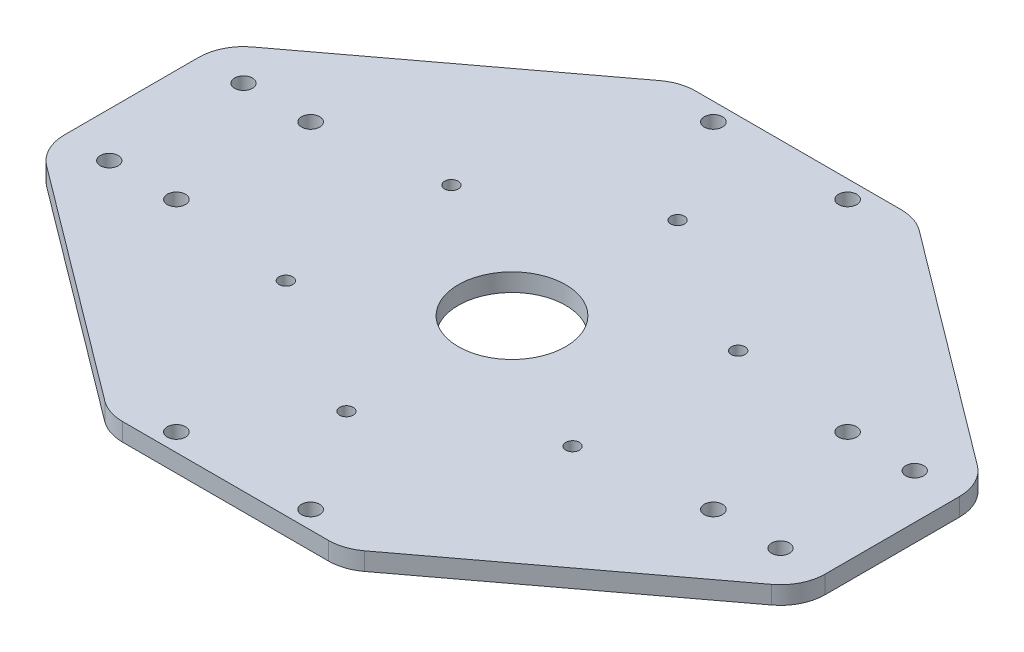
ISO-10303-21;
HEADER;
FILE_DESCRIPTION(('STEP AP214'),'2;1');
FILE_NAME('part.step','',(''),(''),'','','');
FILE_SCHEMA(('AUTOMOTIVE_DESIGN { 1 0 10303 214 1 1 1 1 }'));
ENDSEC;
DATA;
#1=APPLICATION_CONTEXT('core data for automotive mechanical design processes');
#2=APPLICATION_PROTOCOL_DEFINITION('international standard','automotive_design',2000,#1);
#3=PRODUCT_CONTEXT('',#1,'mechanical');
#4=PRODUCT('Part','Part','',(#3));
#5=PRODUCT_RELATED_PRODUCT_CATEGORY('part','',(#4));
#6=PRODUCT_DEFINITION_FORMATION('','',#4);
#7=PRODUCT_DEFINITION_CONTEXT('part definition',#1,'design');
#8=PRODUCT_DEFINITION('design','',#6,#7);
#9=PRODUCT_DEFINITION_SHAPE('','',#8);
#10=(LENGTH_UNIT() NAMED_UNIT(*) SI_UNIT(.MILLI.,.METRE.));
#11=(NAMED_UNIT(*) PLANE_ANGLE_UNIT() SI_UNIT($,.RADIAN.));
#12=(NAMED_UNIT(*) SI_UNIT($,.STERADIAN.) SOLID_ANGLE_UNIT());
#13=UNCERTAINTY_MEASURE_WITH_UNIT(LENGTH_MEASURE(1.E-05),#10,'distance_accuracy_value','');
#14=(GEOMETRIC_REPRESENTATION_CONTEXT(3) GLOBAL_UNCERTAINTY_ASSIGNED_CONTEXT((#13)) GLOBAL_UNIT_ASSIGNED_CONTEXT((#10,
#11,#12)) REPRESENTATION_CONTEXT('',''));
#15=CARTESIAN_POINT('',(0.,0.,0.));
#16=DIRECTION('',(0.,0.,1.));
#17=DIRECTION('',(1.,0.,0.));
#18=AXIS2_PLACEMENT_3D('',#15,#16,#17);
#19=CARTESIAN_POINT('',(85.,4.,-65.));
#20=DIRECTION('',(-1.,0.,0.));
#21=DIRECTION('',(0.,0.,1.));
#22=AXIS2_PLACEMENT_3D('',#19,#20,#21);
#23=PLANE('',#22);
#24=DIRECTION('',(0.,0.,-1.));
#25=VECTOR('',#24,1.);
#26=CARTESIAN_POINT('',(85.,4.,-65.));
#27=LINE('',#26,#25);
#28=CARTESIAN_POINT('',(85.,4.,15.));
#29=VERTEX_POINT('',#28);
#30=CARTESIAN_POINT('',(85.,4.,-15.));
#31=VERTEX_POINT('',#30);
#32=EDGE_CURVE('E306',#29,#31,#27,.T.);
#33=ORIENTED_EDGE('',*,*,#32,.F.);
#34=DIRECTION('',(0.,1.,0.));
#35=VECTOR('',#34,1.);
#36=CARTESIAN_POINT('',(85.,4.,15.));
#37=LINE('',#36,#35);
#38=CARTESIAN_POINT('',(85.,0.,15.));
#39=VERTEX_POINT('',#38);
#40=EDGE_CURVE('E375',#29,#39,#37,.F.);
#41=ORIENTED_EDGE('',*,*,#40,.T.);
#42=DIRECTION('',(0.,0.,-1.));
#43=VECTOR('',#42,1.);
#44=CARTESIAN_POINT('',(85.,0.,-65.));
#45=LINE('',#44,#43);
#46=CARTESIAN_POINT('',(85.,0.,-15.));
#47=VERTEX_POINT('',#46);
#48=EDGE_CURVE('E303',#39,#47,#45,.T.);
#49=ORIENTED_EDGE('',*,*,#48,.T.);
#50=DIRECTION('',(0.,1.,0.));
#51=VECTOR('',#50,1.);
#52=CARTESIAN_POINT('',(85.,4.,-15.));
#53=LINE('',#52,#51);
#54=EDGE_CURVE('E367',#47,#31,#53,.T.);
#55=ORIENTED_EDGE('',*,*,#54,.T.);
#56=EDGE_LOOP('',(#33,#41,#49,#55));
#57=FACE_BOUND('',#56,.T.);
#58=ADVANCED_FACE('F41',(#57),#23,.F.);
#59=CARTESIAN_POINT('',(-85.,4.,-65.));
#60=DIRECTION('',(1.,0.,0.));
#61=DIRECTION('',(0.,0.,-1.));
#62=AXIS2_PLACEMENT_3D('',#59,#60,#61);
#63=PLANE('',#62);
#64=DIRECTION('',(0.,0.,1.));
#65=VECTOR('',#64,1.);
#66=CARTESIAN_POINT('',(-85.,4.,-65.));
#67=LINE('',#66,#65);
#68=CARTESIAN_POINT('',(-85.,4.,-15.));
#69=VERTEX_POINT('',#68);
#70=CARTESIAN_POINT('',(-85.,4.,15.));
#71=VERTEX_POINT('',#70);
#72=EDGE_CURVE('E307',#69,#71,#67,.T.);
#73=ORIENTED_EDGE('',*,*,#72,.F.);
#74=DIRECTION('',(0.,1.,0.));
#75=VECTOR('',#74,1.);
#76=CARTESIAN_POINT('',(-85.,4.,-15.));
#77=LINE('',#76,#75);
#78=CARTESIAN_POINT('',(-85.,0.,-15.));
#79=VERTEX_POINT('',#78);
#80=EDGE_CURVE('E158',#69,#79,#77,.F.);
#81=ORIENTED_EDGE('',*,*,#80,.T.);
#82=DIRECTION('',(0.,0.,1.));
#83=VECTOR('',#82,1.);
#84=CARTESIAN_POINT('',(-85.,0.,-65.));
#85=LINE('',#84,#83);
#86=CARTESIAN_POINT('',(-85.,0.,15.));
#87=VERTEX_POINT('',#86);
#88=EDGE_CURVE('E309',#79,#87,#85,.T.);
#89=ORIENTED_EDGE('',*,*,#88,.T.);
#90=DIRECTION('',(0.,1.,0.));
#91=VECTOR('',#90,1.);
#92=CARTESIAN_POINT('',(-85.,4.,15.));
#93=LINE('',#92,#91);
#94=EDGE_CURVE('E164',#87,#71,#93,.T.);
#95=ORIENTED_EDGE('',*,*,#94,.T.);
#96=EDGE_LOOP('',(#73,#81,#89,#95));
#97=FACE_BOUND('',#96,.T.);
#98=ADVANCED_FACE('F442',(#97),#63,.F.);
#99=CARTESIAN_POINT('',(0.,4.,0.));
#100=DIRECTION('',(0.,1.,0.));
#101=DIRECTION('',(0.,0.,1.));
#102=AXIS2_PLACEMENT_3D('',#99,#100,#101);
#103=PLANE('',#102);
#104=DIRECTION('',(0.8,0.,-0.6));
#105=VECTOR('',#104,1.);
#106=CARTESIAN_POINT('',(-25.,4.,-65.));
#107=LINE('',#106,#105);
#108=CARTESIAN_POINT('',(-81.,4.,-23.));
#109=VERTEX_POINT('',#108);
#110=CARTESIAN_POINT('',(-29.,4.,-62.));
#111=VERTEX_POINT('',#110);
#112=EDGE_CURVE('E175',#109,#111,#107,.T.);
#113=ORIENTED_EDGE('',*,*,#112,.F.);
#114=CARTESIAN_POINT('',(-75.,4.,-15.));
#115=DIRECTION('',(0.,1.,0.));
#116=DIRECTION('',(0.,0.,1.));
#117=AXIS2_PLACEMENT_3D('',#114,#115,#116);
#118=CIRCLE('',#117,10.);
#119=EDGE_CURVE('E152',#109,#69,#118,.T.);
#120=ORIENTED_EDGE('',*,*,#119,.T.);
#121=ORIENTED_EDGE('',*,*,#72,.T.);
#122=CARTESIAN_POINT('',(-75.,4.,15.));
#123=DIRECTION('',(0.,1.,0.));
#124=DIRECTION('',(0.,0.,1.));
#125=AXIS2_PLACEMENT_3D('',#122,#123,#124);
#126=CIRCLE('',#125,10.);
#127=CARTESIAN_POINT('',(-81.,4.,23.));
#128=VERTEX_POINT('',#127);
#129=EDGE_CURVE('E168',#71,#128,#126,.T.);
#130=ORIENTED_EDGE('',*,*,#129,.T.);
#131=DIRECTION('',(-0.8,0.,-0.6));
#132=VECTOR('',#131,1.);
#133=CARTESIAN_POINT('',(-25.,4.,65.));
#134=LINE('',#133,#132);
#135=CARTESIAN_POINT('',(-28.9999999999999,4.,62.0000000000001));
#136=VERTEX_POINT('',#135);
#137=EDGE_CURVE('E183',#136,#128,#134,.T.);
#138=ORIENTED_EDGE('',*,*,#137,.F.);
#139=CARTESIAN_POINT('',(-22.9999999999999,4.,54.0000000000001));
#140=DIRECTION('',(0.,1.,0.));
#141=DIRECTION('',(0.,0.,1.));
#142=AXIS2_PLACEMENT_3D('',#139,#140,#141);
#143=CIRCLE('',#142,10.);
#144=CARTESIAN_POINT('',(-22.9999999999999,4.,64.0000000000001));
#145=VERTEX_POINT('',#144);
#146=EDGE_CURVE('E176',#136,#145,#143,.T.);
#147=ORIENTED_EDGE('',*,*,#146,.T.);
#148=DIRECTION('',(-1.,0.,0.));
#149=VECTOR('',#148,1.);
#150=CARTESIAN_POINT('',(-26.3333333333333,4.,64.0000000000001));
#151=LINE('',#150,#149);
#152=CARTESIAN_POINT('',(23.,4.,64.));
#153=VERTEX_POINT('',#152);
#154=EDGE_CURVE('E393',#153,#145,#151,.T.);
#155=ORIENTED_EDGE('',*,*,#154,.F.);
#156=CARTESIAN_POINT('',(23.,4.,54.));
#157=DIRECTION('',(0.,1.,0.));
#158=DIRECTION('',(0.,0.,1.));
#159=AXIS2_PLACEMENT_3D('',#156,#157,#158);
#160=CIRCLE('',#159,10.);
#161=CARTESIAN_POINT('',(29.,4.,62.));
#162=VERTEX_POINT('',#161);
#163=EDGE_CURVE('E331',#153,#162,#160,.T.);
#164=ORIENTED_EDGE('',*,*,#163,.T.);
#165=DIRECTION('',(-0.8,0.,0.6));
#166=VECTOR('',#165,1.);
#167=CARTESIAN_POINT('',(25.,4.,65.));
#168=LINE('',#167,#166);
#169=CARTESIAN_POINT('',(81.,4.,23.));
#170=VERTEX_POINT('',#169);
#171=EDGE_CURVE('E186',#170,#162,#168,.T.);
#172=ORIENTED_EDGE('',*,*,#171,.F.);
#173=CARTESIAN_POINT('',(75.,4.,15.));
#174=DIRECTION('',(0.,1.,0.));
#175=DIRECTION('',(0.,0.,1.));
#176=AXIS2_PLACEMENT_3D('',#173,#174,#175);
#177=CIRCLE('',#176,10.);
#178=EDGE_CURVE('E335',#170,#29,#177,.T.);
#179=ORIENTED_EDGE('',*,*,#178,.T.);
#180=ORIENTED_EDGE('',*,*,#32,.T.);
#181=CARTESIAN_POINT('',(75.,4.,-15.));
#182=DIRECTION('',(0.,1.,0.));
#183=DIRECTION('',(0.,0.,1.));
#184=AXIS2_PLACEMENT_3D('',#181,#182,#183);
#185=CIRCLE('',#184,10.);
#186=CARTESIAN_POINT('',(81.,4.,-23.));
#187=VERTEX_POINT('',#186);
#188=EDGE_CURVE('E327',#31,#187,#185,.T.);
#189=ORIENTED_EDGE('',*,*,#188,.T.);
#190=DIRECTION('',(0.8,0.,0.6));
#191=VECTOR('',#190,1.);
#192=CARTESIAN_POINT('',(25.,4.,-65.));
#193=LINE('',#192,#191);
#194=CARTESIAN_POINT('',(29.,4.,-62.));
#195=VERTEX_POINT('',#194);
#196=EDGE_CURVE('E192',#195,#187,#193,.T.);
#197=ORIENTED_EDGE('',*,*,#196,.F.);
#198=CARTESIAN_POINT('',(23.,4.,-54.));
#199=DIRECTION('',(0.,1.,0.));
#200=DIRECTION('',(0.,0.,1.));
#201=AXIS2_PLACEMENT_3D('',#198,#199,#200);
#202=CIRCLE('',#201,10.);
#203=CARTESIAN_POINT('',(23.,4.,-64.));
#204=VERTEX_POINT('',#203);
#205=EDGE_CURVE('E326',#195,#204,#202,.T.);
#206=ORIENTED_EDGE('',*,*,#205,.T.);
#207=DIRECTION('',(1.,0.,0.));
#208=VECTOR('',#207,1.);
#209=CARTESIAN_POINT('',(-26.3333333333333,4.,-64.));
#210=LINE('',#209,#208);
#211=CARTESIAN_POINT('',(-23.,4.,-64.));
#212=VERTEX_POINT('',#211);
#213=EDGE_CURVE('E381',#212,#204,#210,.T.);
#214=ORIENTED_EDGE('',*,*,#213,.F.);
#215=CARTESIAN_POINT('',(-23.,4.,-54.));
#216=DIRECTION('',(0.,1.,0.));
#217=DIRECTION('',(0.,0.,1.));
#218=AXIS2_PLACEMENT_3D('',#215,#216,#217);
#219=CIRCLE('',#218,10.);
#220=EDGE_CURVE('E185',#212,#111,#219,.T.);
#221=ORIENTED_EDGE('',*,*,#220,.T.);
#222=EDGE_LOOP('',(#113,#120,#121,#130,#138,#147,#155,#164,#172,#179,#180,#189,#197,#206,#214,#221));
#223=FACE_BOUND('',#222,.T.);
#224=CARTESIAN_POINT('',(-75.,4.,15.));
#225=DIRECTION('',(0.,1.,0.));
#226=DIRECTION('',(0.,0.,-1.));
#227=AXIS2_PLACEMENT_3D('',#224,#225,#226);
#228=CIRCLE('',#227,2.);
#229=CARTESIAN_POINT('',(-75.,4.,13.));
#230=VERTEX_POINT('',#229);
#231=EDGE_CURVE('E232',#230,#230,#228,.T.);
#232=ORIENTED_EDGE('',*,*,#231,.F.);
#233=EDGE_LOOP('',(#232));
#234=FACE_BOUND('',#233,.T.);
#235=CARTESIAN_POINT('',(60.,4.,-15.));
#236=DIRECTION('',(0.,1.,0.));
#237=DIRECTION('',(0.,0.,1.));
#238=AXIS2_PLACEMENT_3D('',#235,#236,#237);
#239=CIRCLE('',#238,2.02499999999999);
#240=CARTESIAN_POINT('',(60.,4.,-12.975));
#241=VERTEX_POINT('',#240);
#242=EDGE_CURVE('E230',#241,#241,#239,.T.);
#243=ORIENTED_EDGE('',*,*,#242,.F.);
#244=EDGE_LOOP('',(#243));
#245=FACE_BOUND('',#244,.T.);
#246=CARTESIAN_POINT('',(75.,4.,15.));
#247=DIRECTION('',(0.,1.,0.));
#248=DIRECTION('',(0.,0.,1.));
#249=AXIS2_PLACEMENT_3D('',#246,#247,#248);
#250=CIRCLE('',#249,2.);
#251=CARTESIAN_POINT('',(75.,4.,17.));
#252=VERTEX_POINT('',#251);
#253=EDGE_CURVE('E225',#252,#252,#250,.T.);
#254=ORIENTED_EDGE('',*,*,#253,.F.);
#255=EDGE_LOOP('',(#254));
#256=FACE_BOUND('',#255,.T.);
#257=CARTESIAN_POINT('',(15.,4.,-60.));
#258=DIRECTION('',(0.,1.,0.));
#259=DIRECTION('',(0.,0.,-1.));
#260=AXIS2_PLACEMENT_3D('',#257,#258,#259);
#261=CIRCLE('',#260,2.025);
#262=CARTESIAN_POINT('',(15.,4.,-62.025));
#263=VERTEX_POINT('',#262);
#264=EDGE_CURVE('E258',#263,#263,#261,.T.);
#265=ORIENTED_EDGE('',*,*,#264,.F.);
#266=EDGE_LOOP('',(#265));
#267=FACE_BOUND('',#266,.T.);
#268=CARTESIAN_POINT('',(75.,4.,-15.));
#269=DIRECTION('',(0.,1.,0.));
#270=DIRECTION('',(0.,0.,-1.));
#271=AXIS2_PLACEMENT_3D('',#268,#269,#270);
#272=CIRCLE('',#271,2.);
#273=CARTESIAN_POINT('',(75.,4.,-17.));
#274=VERTEX_POINT('',#273);
#275=EDGE_CURVE('E254',#274,#274,#272,.T.);
#276=ORIENTED_EDGE('',*,*,#275,.F.);
#277=EDGE_LOOP('',(#276));
#278=FACE_BOUND('',#277,.T.);
#279=CARTESIAN_POINT('',(-75.,4.,-15.));
#280=DIRECTION('',(0.,1.,0.));
#281=DIRECTION('',(0.,0.,1.));
#282=AXIS2_PLACEMENT_3D('',#279,#280,#281);
#283=CIRCLE('',#282,2.);
#284=CARTESIAN_POINT('',(-75.,4.,-13.));
#285=VERTEX_POINT('',#284);
#286=EDGE_CURVE('E250',#285,#285,#283,.T.);
#287=ORIENTED_EDGE('',*,*,#286,.F.);
#288=EDGE_LOOP('',(#287));
#289=FACE_BOUND('',#288,.T.);
#290=CARTESIAN_POINT('',(-15.,4.,-60.));
#291=DIRECTION('',(0.,1.,0.));
#292=DIRECTION('',(0.,0.,1.));
#293=AXIS2_PLACEMENT_3D('',#290,#291,#292);
#294=CIRCLE('',#293,2.025);
#295=CARTESIAN_POINT('',(-15.,4.,-57.975));
#296=VERTEX_POINT('',#295);
#297=EDGE_CURVE('E239',#296,#296,#294,.T.);
#298=ORIENTED_EDGE('',*,*,#297,.F.);
#299=EDGE_LOOP('',(#298));
#300=FACE_BOUND('',#299,.T.);
#301=CARTESIAN_POINT('',(-60.,4.,-15.));
#302=DIRECTION('',(0.,1.,0.));
#303=DIRECTION('',(0.,0.,-1.));
#304=AXIS2_PLACEMENT_3D('',#301,#302,#303);
#305=CIRCLE('',#304,2.025);
#306=CARTESIAN_POINT('',(-60.,4.,-17.025));
#307=VERTEX_POINT('',#306);
#308=EDGE_CURVE('E190',#307,#307,#305,.T.);
#309=ORIENTED_EDGE('',*,*,#308,.F.);
#310=EDGE_LOOP('',(#309));
#311=FACE_BOUND('',#310,.T.);
#312=CARTESIAN_POINT('',(-60.,4.,15.));
#313=DIRECTION('',(0.,1.,0.));
#314=DIRECTION('',(0.,0.,1.));
#315=AXIS2_PLACEMENT_3D('',#312,#313,#314);
#316=CIRCLE('',#315,2.025);
#317=CARTESIAN_POINT('',(-60.,4.,17.025));
#318=VERTEX_POINT('',#317);
#319=EDGE_CURVE('E205',#318,#318,#316,.T.);
#320=ORIENTED_EDGE('',*,*,#319,.F.);
#321=EDGE_LOOP('',(#320));
#322=FACE_BOUND('',#321,.T.);
#323=CARTESIAN_POINT('',(-15.,4.,60.));
#324=DIRECTION('',(0.,1.,0.));
#325=DIRECTION('',(0.,0.,-1.));
#326=AXIS2_PLACEMENT_3D('',#323,#324,#325);
#327=CIRCLE('',#326,2.025);
#328=CARTESIAN_POINT('',(-15.,4.,57.975));
#329=VERTEX_POINT('',#328);
#330=EDGE_CURVE('E194',#329,#329,#327,.T.);
#331=ORIENTED_EDGE('',*,*,#330,.F.);
#332=EDGE_LOOP('',(#331));
#333=FACE_BOUND('',#332,.T.);
#334=CARTESIAN_POINT('',(60.,4.,15.));
#335=DIRECTION('',(0.,1.,0.));
#336=DIRECTION('',(0.,0.,-1.));
#337=AXIS2_PLACEMENT_3D('',#334,#335,#336);
#338=CIRCLE('',#337,2.02499999999999);
#339=CARTESIAN_POINT('',(60.,4.,12.975));
#340=VERTEX_POINT('',#339);
#341=EDGE_CURVE('E208',#340,#340,#338,.T.);
#342=ORIENTED_EDGE('',*,*,#341,.F.);
#343=EDGE_LOOP('',(#342));
#344=FACE_BOUND('',#343,.T.);
#345=CARTESIAN_POINT('',(15.,4.,60.));
#346=DIRECTION('',(0.,1.,0.));
#347=DIRECTION('',(0.,0.,1.));
#348=AXIS2_PLACEMENT_3D('',#345,#346,#347);
#349=CIRCLE('',#348,2.025);
#350=CARTESIAN_POINT('',(15.,4.,62.025));
#351=VERTEX_POINT('',#350);
#352=EDGE_CURVE('E220',#351,#351,#349,.T.);
#353=ORIENTED_EDGE('',*,*,#352,.F.);
#354=EDGE_LOOP('',(#353));
#355=FACE_BOUND('',#354,.T.);
#356=CARTESIAN_POINT('',(32.0429399400242,4.,-18.5));
#357=DIRECTION('',(0.,1.,0.));
#358=DIRECTION('',(0.,0.,1.));
#359=AXIS2_PLACEMENT_3D('',#356,#357,#358);
#360=CIRCLE('',#359,1.525);
#361=CARTESIAN_POINT('',(32.0429399400242,4.,-16.975));
#362=VERTEX_POINT('',#361);
#363=EDGE_CURVE('E268',#362,#362,#360,.T.);
#364=ORIENTED_EDGE('',*,*,#363,.F.);
#365=EDGE_LOOP('',(#364));
#366=FACE_BOUND('',#365,.T.);
#367=CARTESIAN_POINT('',(-32.0429399400242,4.,-18.5));
#368=DIRECTION('',(0.,1.,0.));
#369=DIRECTION('',(0.,0.,1.));
#370=AXIS2_PLACEMENT_3D('',#367,#368,#369);
#371=CIRCLE('',#370,1.525);
#372=CARTESIAN_POINT('',(-32.0429399400242,4.,-16.975));
#373=VERTEX_POINT('',#372);
#374=EDGE_CURVE('E285',#373,#373,#371,.T.);
#375=ORIENTED_EDGE('',*,*,#374,.F.);
#376=EDGE_LOOP('',(#375));
#377=FACE_BOUND('',#376,.T.);
#378=CARTESIAN_POINT('',(0.,4.,0.));
#379=DIRECTION('',(0.,1.,0.));
#380=DIRECTION('',(0.,0.,1.));
#381=AXIS2_PLACEMENT_3D('',#378,#379,#380);
#382=CIRCLE('',#381,12.);
#383=CARTESIAN_POINT('',(0.,4.,12.));
#384=VERTEX_POINT('',#383);
#385=EDGE_CURVE('E295',#384,#384,#382,.T.);
#386=ORIENTED_EDGE('',*,*,#385,.F.);
#387=EDGE_LOOP('',(#386));
#388=FACE_BOUND('',#387,.T.);
#389=CARTESIAN_POINT('',(0.,4.,37.));
#390=DIRECTION('',(0.,1.,0.));
#391=DIRECTION('',(0.,0.,1.));
#392=AXIS2_PLACEMENT_3D('',#389,#390,#391);
#393=CIRCLE('',#392,1.525);
#394=CARTESIAN_POINT('',(0.,4.,38.525));
#395=VERTEX_POINT('',#394);
#396=EDGE_CURVE('E297',#395,#395,#393,.T.);
#397=ORIENTED_EDGE('',*,*,#396,.F.);
#398=EDGE_LOOP('',(#397));
#399=FACE_BOUND('',#398,.T.);
#400=CARTESIAN_POINT('',(-32.0429399400242,4.,18.5));
#401=DIRECTION('',(0.,1.,0.));
#402=DIRECTION('',(0.,0.,1.));
#403=AXIS2_PLACEMENT_3D('',#400,#401,#402);
#404=CIRCLE('',#403,1.525);
#405=CARTESIAN_POINT('',(-32.0429399400242,4.,20.025));
#406=VERTEX_POINT('',#405);
#407=EDGE_CURVE('E289',#406,#406,#404,.T.);
#408=ORIENTED_EDGE('',*,*,#407,.F.);
#409=EDGE_LOOP('',(#408));
#410=FACE_BOUND('',#409,.T.);
#411=CARTESIAN_POINT('',(0.,4.,-37.));
#412=DIRECTION('',(0.,1.,0.));
#413=DIRECTION('',(0.,0.,1.));
#414=AXIS2_PLACEMENT_3D('',#411,#412,#413);
#415=CIRCLE('',#414,1.525);
#416=CARTESIAN_POINT('',(0.,4.,-35.475));
#417=VERTEX_POINT('',#416);
#418=EDGE_CURVE('E276',#417,#417,#415,.T.);
#419=ORIENTED_EDGE('',*,*,#418,.F.);
#420=EDGE_LOOP('',(#419));
#421=FACE_BOUND('',#420,.T.);
#422=CARTESIAN_POINT('',(32.0429399400242,4.,18.5));
#423=DIRECTION('',(0.,1.,0.));
#424=DIRECTION('',(0.,0.,1.));
#425=AXIS2_PLACEMENT_3D('',#422,#423,#424);
#426=CIRCLE('',#425,1.525);
#427=CARTESIAN_POINT('',(32.0429399400242,4.,20.025));
#428=VERTEX_POINT('',#427);
#429=EDGE_CURVE('E264',#428,#428,#426,.T.);
#430=ORIENTED_EDGE('',*,*,#429,.F.);
#431=EDGE_LOOP('',(#430));
#432=FACE_BOUND('',#431,.T.);
#433=ADVANCED_FACE('F177',(#223,#234,#245,#256,#267,#278,#289,#300,#311,#322,#333,#344,#355,
#366,#377,#388,#399,#410,#421,#432),#103,.T.);
#434=CARTESIAN_POINT('',(0.,0.,0.));
#435=DIRECTION('',(0.,1.,0.));
#436=DIRECTION('',(0.,0.,1.));
#437=AXIS2_PLACEMENT_3D('',#434,#435,#436);
#438=PLANE('',#437);
#439=CARTESIAN_POINT('',(-75.,0.,15.));
#440=DIRECTION('',(0.,1.,0.));
#441=DIRECTION('',(0.,0.,-1.));
#442=AXIS2_PLACEMENT_3D('',#439,#440,#441);
#443=CIRCLE('',#442,2.);
#444=CARTESIAN_POINT('',(-75.,0.,13.));
#445=VERTEX_POINT('',#444);
#446=EDGE_CURVE('E212',#445,#445,#443,.T.);
#447=ORIENTED_EDGE('',*,*,#446,.T.);
#448=EDGE_LOOP('',(#447));
#449=FACE_BOUND('',#448,.T.);
#450=CARTESIAN_POINT('',(60.,0.,-15.));
#451=DIRECTION('',(0.,1.,0.));
#452=DIRECTION('',(0.,0.,1.));
#453=AXIS2_PLACEMENT_3D('',#450,#451,#452);
#454=CIRCLE('',#453,2.02499999999999);
#455=CARTESIAN_POINT('',(60.,0.,-12.975));
#456=VERTEX_POINT('',#455);
#457=EDGE_CURVE('E235',#456,#456,#454,.T.);
#458=ORIENTED_EDGE('',*,*,#457,.T.);
#459=EDGE_LOOP('',(#458));
#460=FACE_BOUND('',#459,.T.);
#461=CARTESIAN_POINT('',(75.,0.,15.));
#462=DIRECTION('',(0.,1.,0.));
#463=DIRECTION('',(0.,0.,1.));
#464=AXIS2_PLACEMENT_3D('',#461,#462,#463);
#465=CIRCLE('',#464,2.);
#466=CARTESIAN_POINT('',(75.,0.,17.));
#467=VERTEX_POINT('',#466);
#468=EDGE_CURVE('E228',#467,#467,#465,.T.);
#469=ORIENTED_EDGE('',*,*,#468,.T.);
#470=EDGE_LOOP('',(#469));
#471=FACE_BOUND('',#470,.T.);
#472=CARTESIAN_POINT('',(15.,0.,-60.));
#473=DIRECTION('',(0.,1.,0.));
#474=DIRECTION('',(0.,0.,-1.));
#475=AXIS2_PLACEMENT_3D('',#472,#473,#474);
#476=CIRCLE('',#475,2.025);
#477=CARTESIAN_POINT('',(15.,0.,-62.025));
#478=VERTEX_POINT('',#477);
#479=EDGE_CURVE('E223',#478,#478,#476,.T.);
#480=ORIENTED_EDGE('',*,*,#479,.T.);
#481=EDGE_LOOP('',(#480));
#482=FACE_BOUND('',#481,.T.);
#483=CARTESIAN_POINT('',(75.,0.,-15.));
#484=DIRECTION('',(0.,1.,0.));
#485=DIRECTION('',(0.,0.,-1.));
#486=AXIS2_PLACEMENT_3D('',#483,#484,#485);
#487=CIRCLE('',#486,2.);
#488=CARTESIAN_POINT('',(75.,0.,-17.));
#489=VERTEX_POINT('',#488);
#490=EDGE_CURVE('E256',#489,#489,#487,.T.);
#491=ORIENTED_EDGE('',*,*,#490,.T.);
#492=EDGE_LOOP('',(#491));
#493=FACE_BOUND('',#492,.T.);
#494=CARTESIAN_POINT('',(-75.,0.,-15.));
#495=DIRECTION('',(0.,1.,0.));
#496=DIRECTION('',(0.,0.,1.));
#497=AXIS2_PLACEMENT_3D('',#494,#495,#496);
#498=CIRCLE('',#497,2.);
#499=CARTESIAN_POINT('',(-75.,0.,-13.));
#500=VERTEX_POINT('',#499);
#501=EDGE_CURVE('E249',#500,#500,#498,.T.);
#502=ORIENTED_EDGE('',*,*,#501,.T.);
#503=EDGE_LOOP('',(#502));
#504=FACE_BOUND('',#503,.T.);
#505=CARTESIAN_POINT('',(-15.,0.,-60.));
#506=DIRECTION('',(0.,1.,0.));
#507=DIRECTION('',(0.,0.,1.));
#508=AXIS2_PLACEMENT_3D('',#505,#506,#507);
#509=CIRCLE('',#508,2.025);
#510=CARTESIAN_POINT('',(-15.,0.,-57.975));
#511=VERTEX_POINT('',#510);
#512=EDGE_CURVE('E242',#511,#511,#509,.T.);
#513=ORIENTED_EDGE('',*,*,#512,.T.);
#514=EDGE_LOOP('',(#513));
#515=FACE_BOUND('',#514,.T.);
#516=CARTESIAN_POINT('',(-60.,0.,-15.));
#517=DIRECTION('',(0.,1.,0.));
#518=DIRECTION('',(0.,0.,-1.));
#519=AXIS2_PLACEMENT_3D('',#516,#517,#518);
#520=CIRCLE('',#519,2.025);
#521=CARTESIAN_POINT('',(-60.,0.,-17.025));
#522=VERTEX_POINT('',#521);
#523=EDGE_CURVE('E182',#522,#522,#520,.T.);
#524=ORIENTED_EDGE('',*,*,#523,.T.);
#525=EDGE_LOOP('',(#524));
#526=FACE_BOUND('',#525,.T.);
#527=CARTESIAN_POINT('',(-60.,0.,15.));
#528=DIRECTION('',(0.,1.,0.));
#529=DIRECTION('',(0.,0.,1.));
#530=AXIS2_PLACEMENT_3D('',#527,#528,#529);
#531=CIRCLE('',#530,2.025);
#532=CARTESIAN_POINT('',(-60.,0.,17.025));
#533=VERTEX_POINT('',#532);
#534=EDGE_CURVE('E203',#533,#533,#531,.T.);
#535=ORIENTED_EDGE('',*,*,#534,.T.);
#536=EDGE_LOOP('',(#535));
#537=FACE_BOUND('',#536,.T.);
#538=CARTESIAN_POINT('',(-15.,0.,60.));
#539=DIRECTION('',(0.,1.,0.));
#540=DIRECTION('',(0.,0.,-1.));
#541=AXIS2_PLACEMENT_3D('',#538,#539,#540);
#542=CIRCLE('',#541,2.025);
#543=CARTESIAN_POINT('',(-15.,0.,57.975));
#544=VERTEX_POINT('',#543);
#545=EDGE_CURVE('E199',#544,#544,#542,.T.);
#546=ORIENTED_EDGE('',*,*,#545,.T.);
#547=EDGE_LOOP('',(#546));
#548=FACE_BOUND('',#547,.T.);
#549=CARTESIAN_POINT('',(60.,0.,15.));
#550=DIRECTION('',(0.,1.,0.));
#551=DIRECTION('',(0.,0.,-1.));
#552=AXIS2_PLACEMENT_3D('',#549,#550,#551);
#553=CIRCLE('',#552,2.02499999999999);
#554=CARTESIAN_POINT('',(60.,0.,12.975));
#555=VERTEX_POINT('',#554);
#556=EDGE_CURVE('E213',#555,#555,#553,.T.);
#557=ORIENTED_EDGE('',*,*,#556,.T.);
#558=EDGE_LOOP('',(#557));
#559=FACE_BOUND('',#558,.T.);
#560=CARTESIAN_POINT('',(15.,0.,60.));
#561=DIRECTION('',(0.,1.,0.));
#562=DIRECTION('',(0.,0.,1.));
#563=AXIS2_PLACEMENT_3D('',#560,#561,#562);
#564=CIRCLE('',#563,2.025);
#565=CARTESIAN_POINT('',(15.,0.,62.025));
#566=VERTEX_POINT('',#565);
#567=EDGE_CURVE('E196',#566,#566,#564,.T.);
#568=ORIENTED_EDGE('',*,*,#567,.T.);
#569=EDGE_LOOP('',(#568));
#570=FACE_BOUND('',#569,.T.);
#571=ORIENTED_EDGE('',*,*,#88,.F.);
#572=CARTESIAN_POINT('',(-75.,0.,-15.));
#573=DIRECTION('',(0.,1.,0.));
#574=DIRECTION('',(0.,0.,1.));
#575=AXIS2_PLACEMENT_3D('',#572,#573,#574);
#576=CIRCLE('',#575,10.);
#577=CARTESIAN_POINT('',(-81.,0.,-23.));
#578=VERTEX_POINT('',#577);
#579=EDGE_CURVE('E354',#79,#578,#576,.F.);
#580=ORIENTED_EDGE('',*,*,#579,.T.);
#581=DIRECTION('',(0.8,0.,-0.6));
#582=VECTOR('',#581,1.);
#583=CARTESIAN_POINT('',(-40.2,0.,-53.6));
#584=LINE('',#583,#582);
#585=CARTESIAN_POINT('',(-29.,0.,-62.));
#586=VERTEX_POINT('',#585);
#587=EDGE_CURVE('E174',#578,#586,#584,.T.);
#588=ORIENTED_EDGE('',*,*,#587,.T.);
#589=CARTESIAN_POINT('',(-23.,0.,-54.));
#590=DIRECTION('',(0.,1.,0.));
#591=DIRECTION('',(0.,0.,1.));
#592=AXIS2_PLACEMENT_3D('',#589,#590,#591);
#593=CIRCLE('',#592,10.);
#594=CARTESIAN_POINT('',(-23.,0.,-64.));
#595=VERTEX_POINT('',#594);
#596=EDGE_CURVE('E341',#586,#595,#593,.F.);
#597=ORIENTED_EDGE('',*,*,#596,.T.);
#598=DIRECTION('',(1.,0.,0.));
#599=VECTOR('',#598,1.);
#600=CARTESIAN_POINT('',(-26.3333333333333,0.,-64.));
#601=LINE('',#600,#599);
#602=CARTESIAN_POINT('',(23.,0.,-64.));
#603=VERTEX_POINT('',#602);
#604=EDGE_CURVE('E390',#595,#603,#601,.T.);
#605=ORIENTED_EDGE('',*,*,#604,.T.);
#606=CARTESIAN_POINT('',(23.,0.,-54.));
#607=DIRECTION('',(0.,1.,0.));
#608=DIRECTION('',(0.,0.,1.));
#609=AXIS2_PLACEMENT_3D('',#606,#607,#608);
#610=CIRCLE('',#609,10.);
#611=CARTESIAN_POINT('',(29.,0.,-62.));
#612=VERTEX_POINT('',#611);
#613=EDGE_CURVE('E342',#603,#612,#610,.F.);
#614=ORIENTED_EDGE('',*,*,#613,.T.);
#615=DIRECTION('',(0.8,0.,0.6));
#616=VECTOR('',#615,1.);
#617=CARTESIAN_POINT('',(40.2,0.,-53.6));
#618=LINE('',#617,#616);
#619=CARTESIAN_POINT('',(81.,0.,-23.));
#620=VERTEX_POINT('',#619);
#621=EDGE_CURVE('E325',#612,#620,#618,.T.);
#622=ORIENTED_EDGE('',*,*,#621,.T.);
#623=CARTESIAN_POINT('',(75.,0.,-15.));
#624=DIRECTION('',(0.,1.,0.));
#625=DIRECTION('',(0.,0.,1.));
#626=AXIS2_PLACEMENT_3D('',#623,#624,#625);
#627=CIRCLE('',#626,10.);
#628=EDGE_CURVE('E344',#620,#47,#627,.F.);
#629=ORIENTED_EDGE('',*,*,#628,.T.);
#630=ORIENTED_EDGE('',*,*,#48,.F.);
#631=CARTESIAN_POINT('',(75.,0.,15.));
#632=DIRECTION('',(0.,1.,0.));
#633=DIRECTION('',(0.,0.,1.));
#634=AXIS2_PLACEMENT_3D('',#631,#632,#633);
#635=CIRCLE('',#634,10.);
#636=CARTESIAN_POINT('',(81.,0.,23.));
#637=VERTEX_POINT('',#636);
#638=EDGE_CURVE('E350',#39,#637,#635,.F.);
#639=ORIENTED_EDGE('',*,*,#638,.T.);
#640=DIRECTION('',(-0.8,0.,0.6));
#641=VECTOR('',#640,1.);
#642=CARTESIAN_POINT('',(40.2,0.,53.6));
#643=LINE('',#642,#641);
#644=CARTESIAN_POINT('',(29.,0.,62.));
#645=VERTEX_POINT('',#644);
#646=EDGE_CURVE('E316',#637,#645,#643,.T.);
#647=ORIENTED_EDGE('',*,*,#646,.T.);
#648=CARTESIAN_POINT('',(23.,0.,54.));
#649=DIRECTION('',(0.,1.,0.));
#650=DIRECTION('',(0.,0.,1.));
#651=AXIS2_PLACEMENT_3D('',#648,#649,#650);
#652=CIRCLE('',#651,10.);
#653=CARTESIAN_POINT('',(23.,0.,64.));
#654=VERTEX_POINT('',#653);
#655=EDGE_CURVE('E349',#645,#654,#652,.F.);
#656=ORIENTED_EDGE('',*,*,#655,.T.);
#657=DIRECTION('',(-1.,0.,0.));
#658=VECTOR('',#657,1.);
#659=CARTESIAN_POINT('',(-26.3333333333333,0.,64.0000000000001));
#660=LINE('',#659,#658);
#661=CARTESIAN_POINT('',(-22.9999999999999,0.,64.0000000000001));
#662=VERTEX_POINT('',#661);
#663=EDGE_CURVE('E392',#654,#662,#660,.T.);
#664=ORIENTED_EDGE('',*,*,#663,.T.);
#665=CARTESIAN_POINT('',(-22.9999999999999,0.,54.0000000000001));
#666=DIRECTION('',(0.,1.,0.));
#667=DIRECTION('',(0.,0.,1.));
#668=AXIS2_PLACEMENT_3D('',#665,#666,#667);
#669=CIRCLE('',#668,10.);
#670=CARTESIAN_POINT('',(-28.9999999999999,0.,62.0000000000001));
#671=VERTEX_POINT('',#670);
#672=EDGE_CURVE('E62',#662,#671,#669,.F.);
#673=ORIENTED_EDGE('',*,*,#672,.T.);
#674=DIRECTION('',(-0.8,0.,-0.6));
#675=VECTOR('',#674,1.);
#676=CARTESIAN_POINT('',(-40.2,0.,53.6));
#677=LINE('',#676,#675);
#678=CARTESIAN_POINT('',(-81.,0.,23.));
#679=VERTEX_POINT('',#678);
#680=EDGE_CURVE('E320',#671,#679,#677,.T.);
#681=ORIENTED_EDGE('',*,*,#680,.T.);
#682=CARTESIAN_POINT('',(-75.,0.,15.));
#683=DIRECTION('',(0.,1.,0.));
#684=DIRECTION('',(0.,0.,1.));
#685=AXIS2_PLACEMENT_3D('',#682,#683,#684);
#686=CIRCLE('',#685,10.);
#687=EDGE_CURVE('E352',#679,#87,#686,.F.);
#688=ORIENTED_EDGE('',*,*,#687,.T.);
#689=EDGE_LOOP('',(#571,#580,#588,#597,#605,#614,#622,#629,#630,#639,#647,#656,#664,#673,#681,#688));
#690=FACE_BOUND('',#689,.T.);
#691=CARTESIAN_POINT('',(0.,0.,37.));
#692=DIRECTION('',(0.,1.,0.));
#693=DIRECTION('',(0.,0.,1.));
#694=AXIS2_PLACEMENT_3D('',#691,#692,#693);
#695=CIRCLE('',#694,1.525);
#696=CARTESIAN_POINT('',(0.,0.,38.525));
#697=VERTEX_POINT('',#696);
#698=EDGE_CURVE('E300',#697,#697,#695,.T.);
#699=ORIENTED_EDGE('',*,*,#698,.T.);
#700=EDGE_LOOP('',(#699));
#701=FACE_BOUND('',#700,.T.);
#702=CARTESIAN_POINT('',(0.,0.,0.));
#703=DIRECTION('',(0.,1.,0.));
#704=DIRECTION('',(0.,0.,1.));
#705=AXIS2_PLACEMENT_3D('',#702,#703,#704);
#706=CIRCLE('',#705,12.);
#707=CARTESIAN_POINT('',(0.,0.,12.));
#708=VERTEX_POINT('',#707);
#709=EDGE_CURVE('E293',#708,#708,#706,.T.);
#710=ORIENTED_EDGE('',*,*,#709,.T.);
#711=EDGE_LOOP('',(#710));
#712=FACE_BOUND('',#711,.T.);
#713=CARTESIAN_POINT('',(-32.0429399400242,0.,18.5));
#714=DIRECTION('',(0.,1.,0.));
#715=DIRECTION('',(0.,0.,1.));
#716=AXIS2_PLACEMENT_3D('',#713,#714,#715);
#717=CIRCLE('',#716,1.525);
#718=CARTESIAN_POINT('',(-32.0429399400242,0.,20.025));
#719=VERTEX_POINT('',#718);
#720=EDGE_CURVE('E282',#719,#719,#717,.T.);
#721=ORIENTED_EDGE('',*,*,#720,.T.);
#722=EDGE_LOOP('',(#721));
#723=FACE_BOUND('',#722,.T.);
#724=CARTESIAN_POINT('',(-32.0429399400242,0.,-18.5));
#725=DIRECTION('',(0.,1.,0.));
#726=DIRECTION('',(0.,0.,1.));
#727=AXIS2_PLACEMENT_3D('',#724,#725,#726);
#728=CIRCLE('',#727,1.525);
#729=CARTESIAN_POINT('',(-32.0429399400242,0.,-16.975));
#730=VERTEX_POINT('',#729);
#731=EDGE_CURVE('E278',#730,#730,#728,.T.);
#732=ORIENTED_EDGE('',*,*,#731,.T.);
#733=EDGE_LOOP('',(#732));
#734=FACE_BOUND('',#733,.T.);
#735=CARTESIAN_POINT('',(0.,0.,-37.));
#736=DIRECTION('',(0.,1.,0.));
#737=DIRECTION('',(0.,0.,1.));
#738=AXIS2_PLACEMENT_3D('',#735,#736,#737);
#739=CIRCLE('',#738,1.525);
#740=CARTESIAN_POINT('',(0.,0.,-35.475));
#741=VERTEX_POINT('',#740);
#742=EDGE_CURVE('E271',#741,#741,#739,.T.);
#743=ORIENTED_EDGE('',*,*,#742,.T.);
#744=EDGE_LOOP('',(#743));
#745=FACE_BOUND('',#744,.T.);
#746=CARTESIAN_POINT('',(32.0429399400242,0.,-18.5));
#747=DIRECTION('',(0.,1.,0.));
#748=DIRECTION('',(0.,0.,1.));
#749=AXIS2_PLACEMENT_3D('',#746,#747,#748);
#750=CIRCLE('',#749,1.525);
#751=CARTESIAN_POINT('',(32.0429399400242,0.,-16.975));
#752=VERTEX_POINT('',#751);
#753=EDGE_CURVE('E270',#752,#752,#750,.T.);
#754=ORIENTED_EDGE('',*,*,#753,.T.);
#755=EDGE_LOOP('',(#754));
#756=FACE_BOUND('',#755,.T.);
#757=CARTESIAN_POINT('',(32.0429399400242,0.,18.5));
#758=DIRECTION('',(0.,1.,0.));
#759=DIRECTION('',(0.,0.,1.));
#760=AXIS2_PLACEMENT_3D('',#757,#758,#759);
#761=CIRCLE('',#760,1.525);
#762=CARTESIAN_POINT('',(32.0429399400242,0.,20.025));
#763=VERTEX_POINT('',#762);
#764=EDGE_CURVE('E243',#763,#763,#761,.T.);
#765=ORIENTED_EDGE('',*,*,#764,.T.);
#766=EDGE_LOOP('',(#765));
#767=FACE_BOUND('',#766,.T.);
#768=ADVANCED_FACE('F414',(#449,#460,#471,#482,#493,#504,#515,#526,#537,#548,#559,#570,#690,
#701,#712,#723,#734,#745,#756,#767),#438,.F.);
#769=CARTESIAN_POINT('',(0.,4.,37.));
#770=DIRECTION('',(0.,-1.,0.));
#771=DIRECTION('',(0.,0.,-1.));
#772=AXIS2_PLACEMENT_3D('',#769,#770,#771);
#773=CYLINDRICAL_SURFACE('',#772,1.525);
#774=ORIENTED_EDGE('',*,*,#396,.T.);
#775=EDGE_LOOP('',(#774));
#776=FACE_BOUND('',#775,.T.);
#777=ORIENTED_EDGE('',*,*,#698,.F.);
#778=EDGE_LOOP('',(#777));
#779=FACE_BOUND('',#778,.T.);
#780=ADVANCED_FACE('F724',(#776,#779),#773,.F.);
#781=CARTESIAN_POINT('',(0.,4.,0.));
#782=DIRECTION('',(0.,-1.,0.));
#783=DIRECTION('',(0.,0.,-1.));
#784=AXIS2_PLACEMENT_3D('',#781,#782,#783);
#785=CYLINDRICAL_SURFACE('',#784,12.);
#786=ORIENTED_EDGE('',*,*,#385,.T.);
#787=EDGE_LOOP('',(#786));
#788=FACE_BOUND('',#787,.T.);
#789=ORIENTED_EDGE('',*,*,#709,.F.);
#790=EDGE_LOOP('',(#789));
#791=FACE_BOUND('',#790,.T.);
#792=ADVANCED_FACE('F713',(#788,#791),#785,.F.);
#793=CARTESIAN_POINT('',(-32.0429399400242,4.,18.5));
#794=DIRECTION('',(0.,-1.,0.));
#795=DIRECTION('',(0.,0.,-1.));
#796=AXIS2_PLACEMENT_3D('',#793,#794,#795);
#797=CYLINDRICAL_SURFACE('',#796,1.525);
#798=ORIENTED_EDGE('',*,*,#407,.T.);
#799=EDGE_LOOP('',(#798));
#800=FACE_BOUND('',#799,.T.);
#801=ORIENTED_EDGE('',*,*,#720,.F.);
#802=EDGE_LOOP('',(#801));
#803=FACE_BOUND('',#802,.T.);
#804=ADVANCED_FACE('F704',(#800,#803),#797,.F.);
#805=CARTESIAN_POINT('',(-32.0429399400242,4.,-18.5));
#806=DIRECTION('',(0.,-1.,0.));
#807=DIRECTION('',(0.,0.,-1.));
#808=AXIS2_PLACEMENT_3D('',#805,#806,#807);
#809=CYLINDRICAL_SURFACE('',#808,1.525);
#810=ORIENTED_EDGE('',*,*,#374,.T.);
#811=EDGE_LOOP('',(#810));
#812=FACE_BOUND('',#811,.T.);
#813=ORIENTED_EDGE('',*,*,#731,.F.);
#814=EDGE_LOOP('',(#813));
#815=FACE_BOUND('',#814,.T.);
#816=ADVANCED_FACE('F696',(#812,#815),#809,.F.);
#817=CARTESIAN_POINT('',(0.,4.,-37.));
#818=DIRECTION('',(0.,-1.,0.));
#819=DIRECTION('',(0.,0.,-1.));
#820=AXIS2_PLACEMENT_3D('',#817,#818,#819);
#821=CYLINDRICAL_SURFACE('',#820,1.525);
#822=ORIENTED_EDGE('',*,*,#418,.T.);
#823=EDGE_LOOP('',(#822));
#824=FACE_BOUND('',#823,.T.);
#825=ORIENTED_EDGE('',*,*,#742,.F.);
#826=EDGE_LOOP('',(#825));
#827=FACE_BOUND('',#826,.T.);
#828=ADVANCED_FACE('F690',(#824,#827),#821,.F.);
#829=CARTESIAN_POINT('',(32.0429399400242,4.,-18.5));
#830=DIRECTION('',(0.,-1.,0.));
#831=DIRECTION('',(0.,0.,-1.));
#832=AXIS2_PLACEMENT_3D('',#829,#830,#831);
#833=CYLINDRICAL_SURFACE('',#832,1.525);
#834=ORIENTED_EDGE('',*,*,#363,.T.);
#835=EDGE_LOOP('',(#834));
#836=FACE_BOUND('',#835,.T.);
#837=ORIENTED_EDGE('',*,*,#753,.F.);
#838=EDGE_LOOP('',(#837));
#839=FACE_BOUND('',#838,.T.);
#840=ADVANCED_FACE('F679',(#836,#839),#833,.F.);
#841=CARTESIAN_POINT('',(32.0429399400242,4.,18.5));
#842=DIRECTION('',(0.,-1.,0.));
#843=DIRECTION('',(0.,0.,-1.));
#844=AXIS2_PLACEMENT_3D('',#841,#842,#843);
#845=CYLINDRICAL_SURFACE('',#844,1.525);
#846=ORIENTED_EDGE('',*,*,#429,.T.);
#847=EDGE_LOOP('',(#846));
#848=FACE_BOUND('',#847,.T.);
#849=ORIENTED_EDGE('',*,*,#764,.F.);
#850=EDGE_LOOP('',(#849));
#851=FACE_BOUND('',#850,.T.);
#852=ADVANCED_FACE('F668',(#848,#851),#845,.F.);
#853=CARTESIAN_POINT('',(15.,0.,60.));
#854=DIRECTION('',(0.,1.,0.));
#855=DIRECTION('',(0.,0.,1.));
#856=AXIS2_PLACEMENT_3D('',#853,#854,#855);
#857=CYLINDRICAL_SURFACE('',#856,2.025);
#858=ORIENTED_EDGE('',*,*,#567,.F.);
#859=EDGE_LOOP('',(#858));
#860=FACE_BOUND('',#859,.T.);
#861=ORIENTED_EDGE('',*,*,#352,.T.);
#862=EDGE_LOOP('',(#861));
#863=FACE_BOUND('',#862,.T.);
#864=ADVANCED_FACE('F658',(#860,#863),#857,.F.);
#865=CARTESIAN_POINT('',(60.,0.,15.));
#866=DIRECTION('',(0.,1.,0.));
#867=DIRECTION('',(0.,0.,1.));
#868=AXIS2_PLACEMENT_3D('',#865,#866,#867);
#869=CYLINDRICAL_SURFACE('',#868,2.02499999999999);
#870=ORIENTED_EDGE('',*,*,#556,.F.);
#871=EDGE_LOOP('',(#870));
#872=FACE_BOUND('',#871,.T.);
#873=ORIENTED_EDGE('',*,*,#341,.T.);
#874=EDGE_LOOP('',(#873));
#875=FACE_BOUND('',#874,.T.);
#876=ADVANCED_FACE('F653',(#872,#875),#869,.F.);
#877=CARTESIAN_POINT('',(-15.,0.,60.));
#878=DIRECTION('',(0.,1.,0.));
#879=DIRECTION('',(0.,0.,1.));
#880=AXIS2_PLACEMENT_3D('',#877,#878,#879);
#881=CYLINDRICAL_SURFACE('',#880,2.025);
#882=ORIENTED_EDGE('',*,*,#545,.F.);
#883=EDGE_LOOP('',(#882));
#884=FACE_BOUND('',#883,.T.);
#885=ORIENTED_EDGE('',*,*,#330,.T.);
#886=EDGE_LOOP('',(#885));
#887=FACE_BOUND('',#886,.T.);
#888=ADVANCED_FACE('F645',(#884,#887),#881,.F.);
#889=CARTESIAN_POINT('',(-60.,0.,15.));
#890=DIRECTION('',(0.,1.,0.));
#891=DIRECTION('',(0.,0.,1.));
#892=AXIS2_PLACEMENT_3D('',#889,#890,#891);
#893=CYLINDRICAL_SURFACE('',#892,2.025);
#894=ORIENTED_EDGE('',*,*,#534,.F.);
#895=EDGE_LOOP('',(#894));
#896=FACE_BOUND('',#895,.T.);
#897=ORIENTED_EDGE('',*,*,#319,.T.);
#898=EDGE_LOOP('',(#897));
#899=FACE_BOUND('',#898,.T.);
#900=ADVANCED_FACE('F633',(#896,#899),#893,.F.);
#901=CARTESIAN_POINT('',(-60.,0.,-15.));
#902=DIRECTION('',(0.,1.,0.));
#903=DIRECTION('',(0.,0.,1.));
#904=AXIS2_PLACEMENT_3D('',#901,#902,#903);
#905=CYLINDRICAL_SURFACE('',#904,2.025);
#906=ORIENTED_EDGE('',*,*,#523,.F.);
#907=EDGE_LOOP('',(#906));
#908=FACE_BOUND('',#907,.T.);
#909=ORIENTED_EDGE('',*,*,#308,.T.);
#910=EDGE_LOOP('',(#909));
#911=FACE_BOUND('',#910,.T.);
#912=ADVANCED_FACE('F624',(#908,#911),#905,.F.);
#913=CARTESIAN_POINT('',(-15.,0.,-60.));
#914=DIRECTION('',(0.,1.,0.));
#915=DIRECTION('',(0.,0.,1.));
#916=AXIS2_PLACEMENT_3D('',#913,#914,#915);
#917=CYLINDRICAL_SURFACE('',#916,2.025);
#918=ORIENTED_EDGE('',*,*,#512,.F.);
#919=EDGE_LOOP('',(#918));
#920=FACE_BOUND('',#919,.T.);
#921=ORIENTED_EDGE('',*,*,#297,.T.);
#922=EDGE_LOOP('',(#921));
#923=FACE_BOUND('',#922,.T.);
#924=ADVANCED_FACE('F613',(#920,#923),#917,.F.);
#925=CARTESIAN_POINT('',(-75.,0.,-15.));
#926=DIRECTION('',(0.,1.,0.));
#927=DIRECTION('',(0.,0.,1.));
#928=AXIS2_PLACEMENT_3D('',#925,#926,#927);
#929=CYLINDRICAL_SURFACE('',#928,2.);
#930=ORIENTED_EDGE('',*,*,#501,.F.);
#931=EDGE_LOOP('',(#930));
#932=FACE_BOUND('',#931,.T.);
#933=ORIENTED_EDGE('',*,*,#286,.T.);
#934=EDGE_LOOP('',(#933));
#935=FACE_BOUND('',#934,.T.);
#936=ADVANCED_FACE('F608',(#932,#935),#929,.F.);
#937=CARTESIAN_POINT('',(75.,0.,-15.));
#938=DIRECTION('',(0.,1.,0.));
#939=DIRECTION('',(0.,0.,1.));
#940=AXIS2_PLACEMENT_3D('',#937,#938,#939);
#941=CYLINDRICAL_SURFACE('',#940,2.);
#942=ORIENTED_EDGE('',*,*,#490,.F.);
#943=EDGE_LOOP('',(#942));
#944=FACE_BOUND('',#943,.T.);
#945=ORIENTED_EDGE('',*,*,#275,.T.);
#946=EDGE_LOOP('',(#945));
#947=FACE_BOUND('',#946,.T.);
#948=ADVANCED_FACE('F600',(#944,#947),#941,.F.);
#949=CARTESIAN_POINT('',(15.,0.,-60.));
#950=DIRECTION('',(0.,1.,0.));
#951=DIRECTION('',(0.,0.,1.));
#952=AXIS2_PLACEMENT_3D('',#949,#950,#951);
#953=CYLINDRICAL_SURFACE('',#952,2.025);
#954=ORIENTED_EDGE('',*,*,#479,.F.);
#955=EDGE_LOOP('',(#954));
#956=FACE_BOUND('',#955,.T.);
#957=ORIENTED_EDGE('',*,*,#264,.T.);
#958=EDGE_LOOP('',(#957));
#959=FACE_BOUND('',#958,.T.);
#960=ADVANCED_FACE('F586',(#956,#959),#953,.F.);
#961=CARTESIAN_POINT('',(75.,0.,15.));
#962=DIRECTION('',(0.,1.,0.));
#963=DIRECTION('',(0.,0.,1.));
#964=AXIS2_PLACEMENT_3D('',#961,#962,#963);
#965=CYLINDRICAL_SURFACE('',#964,2.);
#966=ORIENTED_EDGE('',*,*,#468,.F.);
#967=EDGE_LOOP('',(#966));
#968=FACE_BOUND('',#967,.T.);
#969=ORIENTED_EDGE('',*,*,#253,.T.);
#970=EDGE_LOOP('',(#969));
#971=FACE_BOUND('',#970,.T.);
#972=ADVANCED_FACE('F576',(#968,#971),#965,.F.);
#973=CARTESIAN_POINT('',(60.,0.,-15.));
#974=DIRECTION('',(0.,1.,0.));
#975=DIRECTION('',(0.,0.,1.));
#976=AXIS2_PLACEMENT_3D('',#973,#974,#975);
#977=CYLINDRICAL_SURFACE('',#976,2.02499999999999);
#978=ORIENTED_EDGE('',*,*,#457,.F.);
#979=EDGE_LOOP('',(#978));
#980=FACE_BOUND('',#979,.T.);
#981=ORIENTED_EDGE('',*,*,#242,.T.);
#982=EDGE_LOOP('',(#981));
#983=FACE_BOUND('',#982,.T.);
#984=ADVANCED_FACE('F569',(#980,#983),#977,.F.);
#985=CARTESIAN_POINT('',(-75.,0.,15.));
#986=DIRECTION('',(0.,1.,0.));
#987=DIRECTION('',(0.,0.,1.));
#988=AXIS2_PLACEMENT_3D('',#985,#986,#987);
#989=CYLINDRICAL_SURFACE('',#988,2.);
#990=ORIENTED_EDGE('',*,*,#446,.F.);
#991=EDGE_LOOP('',(#990));
#992=FACE_BOUND('',#991,.T.);
#993=ORIENTED_EDGE('',*,*,#231,.T.);
#994=EDGE_LOOP('',(#993));
#995=FACE_BOUND('',#994,.T.);
#996=ADVANCED_FACE('F555',(#992,#995),#989,.F.);
#997=CARTESIAN_POINT('',(-25.,-6.,-65.));
#998=DIRECTION('',(0.6,0.,0.8));
#999=DIRECTION('',(0.8,0.,-0.6));
#1000=AXIS2_PLACEMENT_3D('',#997,#998,#999);
#1001=PLANE('',#1000);
#1002=ORIENTED_EDGE('',*,*,#587,.F.);
#1003=DIRECTION('',(0.,1.,0.));
#1004=VECTOR('',#1003,1.);
#1005=CARTESIAN_POINT('',(-81.,-6.,-23.));
#1006=LINE('',#1005,#1004);
#1007=EDGE_CURVE('E156',#578,#109,#1006,.T.);
#1008=ORIENTED_EDGE('',*,*,#1007,.T.);
#1009=ORIENTED_EDGE('',*,*,#112,.T.);
#1010=DIRECTION('',(0.,1.,0.));
#1011=VECTOR('',#1010,1.);
#1012=CARTESIAN_POINT('',(-29.,-6.,-62.));
#1013=LINE('',#1012,#1011);
#1014=EDGE_CURVE('E180',#111,#586,#1013,.F.);
#1015=ORIENTED_EDGE('',*,*,#1014,.T.);
#1016=EDGE_LOOP('',(#1002,#1008,#1009,#1015));
#1017=FACE_BOUND('',#1016,.T.);
#1018=ADVANCED_FACE('F171',(#1017),#1001,.F.);
#1019=CARTESIAN_POINT('',(-25.,-6.,65.));
#1020=DIRECTION('',(0.6,0.,-0.8));
#1021=DIRECTION('',(-0.8,0.,-0.6));
#1022=AXIS2_PLACEMENT_3D('',#1019,#1020,#1021);
#1023=PLANE('',#1022);
#1024=ORIENTED_EDGE('',*,*,#137,.T.);
#1025=DIRECTION('',(0.,1.,0.));
#1026=VECTOR('',#1025,1.);
#1027=CARTESIAN_POINT('',(-81.,-6.,23.));
#1028=LINE('',#1027,#1026);
#1029=EDGE_CURVE('E57',#128,#679,#1028,.F.);
#1030=ORIENTED_EDGE('',*,*,#1029,.T.);
#1031=ORIENTED_EDGE('',*,*,#680,.F.);
#1032=DIRECTION('',(0.,1.,0.));
#1033=VECTOR('',#1032,1.);
#1034=CARTESIAN_POINT('',(-28.9999999999999,-6.,62.0000000000001));
#1035=LINE('',#1034,#1033);
#1036=EDGE_CURVE('E353',#671,#136,#1035,.T.);
#1037=ORIENTED_EDGE('',*,*,#1036,.T.);
#1038=EDGE_LOOP('',(#1024,#1030,#1031,#1037));
#1039=FACE_BOUND('',#1038,.T.);
#1040=ADVANCED_FACE('F440',(#1039),#1023,.F.);
#1041=CARTESIAN_POINT('',(25.,-6.,65.));
#1042=DIRECTION('',(-0.6,0.,-0.8));
#1043=DIRECTION('',(-0.8,0.,0.6));
#1044=AXIS2_PLACEMENT_3D('',#1041,#1042,#1043);
#1045=PLANE('',#1044);
#1046=ORIENTED_EDGE('',*,*,#171,.T.);
#1047=DIRECTION('',(0.,1.,0.));
#1048=VECTOR('',#1047,1.);
#1049=CARTESIAN_POINT('',(29.,-6.,62.));
#1050=LINE('',#1049,#1048);
#1051=EDGE_CURVE('E370',#162,#645,#1050,.F.);
#1052=ORIENTED_EDGE('',*,*,#1051,.T.);
#1053=ORIENTED_EDGE('',*,*,#646,.F.);
#1054=DIRECTION('',(0.,1.,0.));
#1055=VECTOR('',#1054,1.);
#1056=CARTESIAN_POINT('',(81.,-6.,23.));
#1057=LINE('',#1056,#1055);
#1058=EDGE_CURVE('E364',#637,#170,#1057,.T.);
#1059=ORIENTED_EDGE('',*,*,#1058,.T.);
#1060=EDGE_LOOP('',(#1046,#1052,#1053,#1059));
#1061=FACE_BOUND('',#1060,.T.);
#1062=ADVANCED_FACE('F424',(#1061),#1045,.F.);
#1063=CARTESIAN_POINT('',(25.,-6.,-65.));
#1064=DIRECTION('',(-0.6,0.,0.8));
#1065=DIRECTION('',(0.8,0.,0.6));
#1066=AXIS2_PLACEMENT_3D('',#1063,#1064,#1065);
#1067=PLANE('',#1066);
#1068=ORIENTED_EDGE('',*,*,#196,.T.);
#1069=DIRECTION('',(0.,1.,0.));
#1070=VECTOR('',#1069,1.);
#1071=CARTESIAN_POINT('',(81.,-6.,-23.));
#1072=LINE('',#1071,#1070);
#1073=EDGE_CURVE('E380',#187,#620,#1072,.F.);
#1074=ORIENTED_EDGE('',*,*,#1073,.T.);
#1075=ORIENTED_EDGE('',*,*,#621,.F.);
#1076=DIRECTION('',(0.,1.,0.));
#1077=VECTOR('',#1076,1.);
#1078=CARTESIAN_POINT('',(29.,-6.,-62.));
#1079=LINE('',#1078,#1077);
#1080=EDGE_CURVE('E372',#612,#195,#1079,.T.);
#1081=ORIENTED_EDGE('',*,*,#1080,.T.);
#1082=EDGE_LOOP('',(#1068,#1074,#1075,#1081));
#1083=FACE_BOUND('',#1082,.T.);
#1084=ADVANCED_FACE('F403',(#1083),#1067,.F.);
#1085=CARTESIAN_POINT('',(-26.3333333333333,0.,-64.));
#1086=DIRECTION('',(0.,0.,1.));
#1087=DIRECTION('',(1.,0.,0.));
#1088=AXIS2_PLACEMENT_3D('',#1085,#1086,#1087);
#1089=PLANE('',#1088);
#1090=ORIENTED_EDGE('',*,*,#213,.T.);
#1091=DIRECTION('',(0.,1.,0.));
#1092=VECTOR('',#1091,1.);
#1093=CARTESIAN_POINT('',(23.,0.,-64.));
#1094=LINE('',#1093,#1092);
#1095=EDGE_CURVE('E11',#204,#603,#1094,.F.);
#1096=ORIENTED_EDGE('',*,*,#1095,.T.);
#1097=ORIENTED_EDGE('',*,*,#604,.F.);
#1098=DIRECTION('',(0.,1.,0.));
#1099=VECTOR('',#1098,1.);
#1100=CARTESIAN_POINT('',(-23.,0.,-64.));
#1101=LINE('',#1100,#1099);
#1102=EDGE_CURVE('E47',#595,#212,#1101,.T.);
#1103=ORIENTED_EDGE('',*,*,#1102,.T.);
#1104=EDGE_LOOP('',(#1090,#1096,#1097,#1103));
#1105=FACE_BOUND('',#1104,.T.);
#1106=ADVANCED_FACE('F384',(#1105),#1089,.F.);
#1107=CARTESIAN_POINT('',(-26.3333333333333,0.,64.0000000000001));
#1108=DIRECTION('',(0.,0.,-1.));
#1109=DIRECTION('',(-1.,0.,0.));
#1110=AXIS2_PLACEMENT_3D('',#1107,#1108,#1109);
#1111=PLANE('',#1110);
#1112=ORIENTED_EDGE('',*,*,#663,.F.);
#1113=DIRECTION('',(0.,1.,0.));
#1114=VECTOR('',#1113,1.);
#1115=CARTESIAN_POINT('',(23.,0.,64.));
#1116=LINE('',#1115,#1114);
#1117=EDGE_CURVE('E363',#654,#153,#1116,.T.);
#1118=ORIENTED_EDGE('',*,*,#1117,.T.);
#1119=ORIENTED_EDGE('',*,*,#154,.T.);
#1120=DIRECTION('',(0.,1.,0.));
#1121=VECTOR('',#1120,1.);
#1122=CARTESIAN_POINT('',(-22.9999999999999,0.,64.0000000000001));
#1123=LINE('',#1122,#1121);
#1124=EDGE_CURVE('E360',#145,#662,#1123,.F.);
#1125=ORIENTED_EDGE('',*,*,#1124,.T.);
#1126=EDGE_LOOP('',(#1112,#1118,#1119,#1125));
#1127=FACE_BOUND('',#1126,.T.);
#1128=ADVANCED_FACE('F431',(#1127),#1111,.F.);
#1129=CARTESIAN_POINT('',(-75.,-6.,-15.));
#1130=DIRECTION('',(0.,1.,0.));
#1131=DIRECTION('',(0.,0.,1.));
#1132=AXIS2_PLACEMENT_3D('',#1129,#1130,#1131);
#1133=CYLINDRICAL_SURFACE('',#1132,10.);
#1134=ORIENTED_EDGE('',*,*,#579,.F.);
#1135=ORIENTED_EDGE('',*,*,#80,.F.);
#1136=ORIENTED_EDGE('',*,*,#119,.F.);
#1137=ORIENTED_EDGE('',*,*,#1007,.F.);
#1138=EDGE_LOOP('',(#1134,#1135,#1136,#1137));
#1139=FACE_BOUND('',#1138,.T.);
#1140=ADVANCED_FACE('F159',(#1139),#1133,.T.);
#1141=CARTESIAN_POINT('',(-75.,4.,15.));
#1142=DIRECTION('',(0.,1.,0.));
#1143=DIRECTION('',(0.,0.,1.));
#1144=AXIS2_PLACEMENT_3D('',#1141,#1142,#1143);
#1145=CYLINDRICAL_SURFACE('',#1144,10.);
#1146=ORIENTED_EDGE('',*,*,#687,.F.);
#1147=ORIENTED_EDGE('',*,*,#1029,.F.);
#1148=ORIENTED_EDGE('',*,*,#129,.F.);
#1149=ORIENTED_EDGE('',*,*,#94,.F.);
#1150=EDGE_LOOP('',(#1146,#1147,#1148,#1149));
#1151=FACE_BOUND('',#1150,.T.);
#1152=ADVANCED_FACE('F441',(#1151),#1145,.T.);
#1153=CARTESIAN_POINT('',(23.,0.,54.));
#1154=DIRECTION('',(0.,1.,0.));
#1155=DIRECTION('',(0.,0.,1.));
#1156=AXIS2_PLACEMENT_3D('',#1153,#1154,#1155);
#1157=CYLINDRICAL_SURFACE('',#1156,10.);
#1158=ORIENTED_EDGE('',*,*,#655,.F.);
#1159=ORIENTED_EDGE('',*,*,#1051,.F.);
#1160=ORIENTED_EDGE('',*,*,#163,.F.);
#1161=ORIENTED_EDGE('',*,*,#1117,.F.);
#1162=EDGE_LOOP('',(#1158,#1159,#1160,#1161));
#1163=FACE_BOUND('',#1162,.T.);
#1164=ADVANCED_FACE('F430',(#1163),#1157,.T.);
#1165=CARTESIAN_POINT('',(75.,-6.,15.));
#1166=DIRECTION('',(0.,1.,0.));
#1167=DIRECTION('',(0.,0.,1.));
#1168=AXIS2_PLACEMENT_3D('',#1165,#1166,#1167);
#1169=CYLINDRICAL_SURFACE('',#1168,10.);
#1170=ORIENTED_EDGE('',*,*,#638,.F.);
#1171=ORIENTED_EDGE('',*,*,#40,.F.);
#1172=ORIENTED_EDGE('',*,*,#178,.F.);
#1173=ORIENTED_EDGE('',*,*,#1058,.F.);
#1174=EDGE_LOOP('',(#1170,#1171,#1172,#1173));
#1175=FACE_BOUND('',#1174,.T.);
#1176=ADVANCED_FACE('F423',(#1175),#1169,.T.);
#1177=CARTESIAN_POINT('',(75.,4.,-15.));
#1178=DIRECTION('',(0.,1.,0.));
#1179=DIRECTION('',(0.,0.,1.));
#1180=AXIS2_PLACEMENT_3D('',#1177,#1178,#1179);
#1181=CYLINDRICAL_SURFACE('',#1180,10.);
#1182=ORIENTED_EDGE('',*,*,#628,.F.);
#1183=ORIENTED_EDGE('',*,*,#1073,.F.);
#1184=ORIENTED_EDGE('',*,*,#188,.F.);
#1185=ORIENTED_EDGE('',*,*,#54,.F.);
#1186=EDGE_LOOP('',(#1182,#1183,#1184,#1185));
#1187=FACE_BOUND('',#1186,.T.);
#1188=ADVANCED_FACE('F409',(#1187),#1181,.T.);
#1189=CARTESIAN_POINT('',(23.,-6.,-54.));
#1190=DIRECTION('',(0.,1.,0.));
#1191=DIRECTION('',(0.,0.,1.));
#1192=AXIS2_PLACEMENT_3D('',#1189,#1190,#1191);
#1193=CYLINDRICAL_SURFACE('',#1192,10.);
#1194=ORIENTED_EDGE('',*,*,#613,.F.);
#1195=ORIENTED_EDGE('',*,*,#1095,.F.);
#1196=ORIENTED_EDGE('',*,*,#205,.F.);
#1197=ORIENTED_EDGE('',*,*,#1080,.F.);
#1198=EDGE_LOOP('',(#1194,#1195,#1196,#1197));
#1199=FACE_BOUND('',#1198,.T.);
#1200=ADVANCED_FACE('F447',(#1199),#1193,.T.);
#1201=CARTESIAN_POINT('',(-23.,0.,-54.));
#1202=DIRECTION('',(0.,1.,0.));
#1203=DIRECTION('',(0.,0.,1.));
#1204=AXIS2_PLACEMENT_3D('',#1201,#1202,#1203);
#1205=CYLINDRICAL_SURFACE('',#1204,10.);
#1206=ORIENTED_EDGE('',*,*,#596,.F.);
#1207=ORIENTED_EDGE('',*,*,#1014,.F.);
#1208=ORIENTED_EDGE('',*,*,#220,.F.);
#1209=ORIENTED_EDGE('',*,*,#1102,.F.);
#1210=EDGE_LOOP('',(#1206,#1207,#1208,#1209));
#1211=FACE_BOUND('',#1210,.T.);
#1212=ADVANCED_FACE('F443',(#1211),#1205,.T.);
#1213=CARTESIAN_POINT('',(-22.9999999999999,-6.,54.0000000000001));
#1214=DIRECTION('',(0.,1.,0.));
#1215=DIRECTION('',(0.,0.,1.));
#1216=AXIS2_PLACEMENT_3D('',#1213,#1214,#1215);
#1217=CYLINDRICAL_SURFACE('',#1216,10.);
#1218=ORIENTED_EDGE('',*,*,#672,.F.);
#1219=ORIENTED_EDGE('',*,*,#1124,.F.);
#1220=ORIENTED_EDGE('',*,*,#146,.F.);
#1221=ORIENTED_EDGE('',*,*,#1036,.F.);
#1222=EDGE_LOOP('',(#1218,#1219,#1220,#1221));
#1223=FACE_BOUND('',#1222,.T.);
#1224=ADVANCED_FACE('F43',(#1223),#1217,.T.);
#1225=CLOSED_SHELL('',(#58,#98,#433,#768,#780,#792,#804,#816,#828,#840,#852,#864,#876,#888,#900,
#912,#924,#936,#948,#960,#972,#984,#996,#1018,#1040,#1062,#1084,#1106,#1128,#1140,#1152,#1164,
#1176,#1188,#1200,#1212,#1224));
#1226=MANIFOLD_SOLID_BREP('B2',#1225);
#1227=ADVANCED_BREP_SHAPE_REPRESENTATION('',(#18,#1226),#14);
#1228=SHAPE_DEFINITION_REPRESENTATION(#9,#1227);
ENDSEC;
END-ISO-10303-21;
